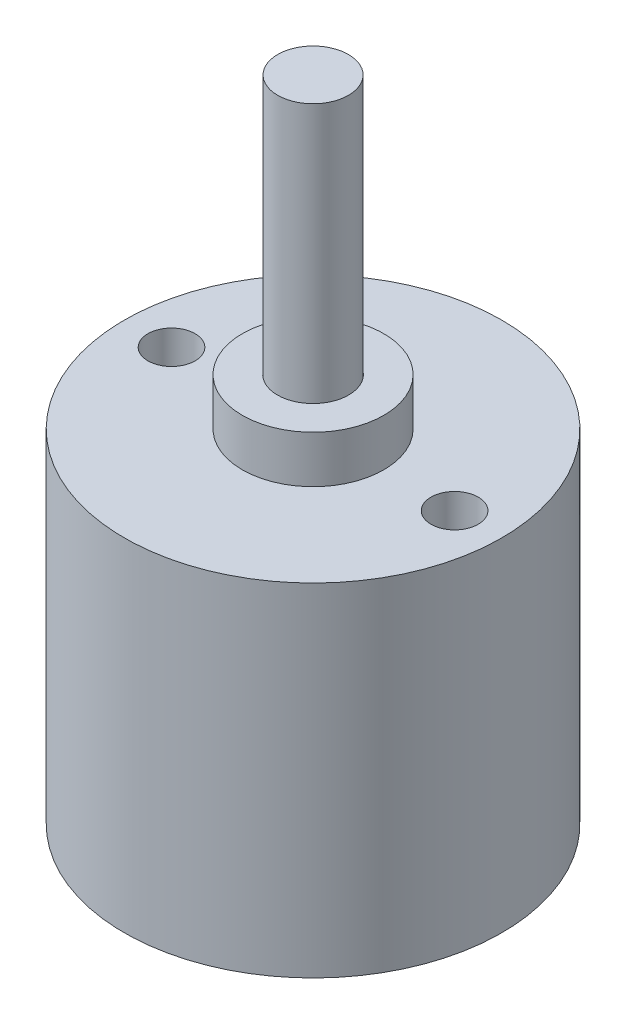
ISO-10303-21;
HEADER;
FILE_DESCRIPTION(('STEP AP214'),'2;1');
FILE_NAME('part.step','',(''),(''),'','','');
FILE_SCHEMA(('AUTOMOTIVE_DESIGN { 1 0 10303 214 1 1 1 1 }'));
ENDSEC;
DATA;
#1=APPLICATION_CONTEXT('core data for automotive mechanical design processes');
#2=APPLICATION_PROTOCOL_DEFINITION('international standard','automotive_design',2000,#1);
#3=PRODUCT_CONTEXT('',#1,'mechanical');
#4=PRODUCT('Part','Part','',(#3));
#5=PRODUCT_RELATED_PRODUCT_CATEGORY('part','',(#4));
#6=PRODUCT_DEFINITION_FORMATION('','',#4);
#7=PRODUCT_DEFINITION_CONTEXT('part definition',#1,'design');
#8=PRODUCT_DEFINITION('design','',#6,#7);
#9=PRODUCT_DEFINITION_SHAPE('','',#8);
#10=(LENGTH_UNIT() NAMED_UNIT(*) SI_UNIT(.MILLI.,.METRE.));
#11=(NAMED_UNIT(*) PLANE_ANGLE_UNIT() SI_UNIT($,.RADIAN.));
#12=(NAMED_UNIT(*) SI_UNIT($,.STERADIAN.) SOLID_ANGLE_UNIT());
#13=UNCERTAINTY_MEASURE_WITH_UNIT(LENGTH_MEASURE(1.E-05),#10,'distance_accuracy_value','');
#14=(GEOMETRIC_REPRESENTATION_CONTEXT(3) GLOBAL_UNCERTAINTY_ASSIGNED_CONTEXT((#13)) GLOBAL_UNIT_ASSIGNED_CONTEXT((#10,
#11,#12)) REPRESENTATION_CONTEXT('',''));
#15=CARTESIAN_POINT('',(0.,0.,0.));
#16=DIRECTION('',(0.,0.,1.));
#17=DIRECTION('',(1.,0.,0.));
#18=AXIS2_PLACEMENT_3D('',#15,#16,#17);
#19=CARTESIAN_POINT('',(0.,9.5,0.));
#20=DIRECTION('',(0.,1.,0.));
#21=DIRECTION('',(0.,0.,1.));
#22=AXIS2_PLACEMENT_3D('',#19,#20,#21);
#23=PLANE('',#22);
#24=CARTESIAN_POINT('',(0.,9.5,0.));
#25=DIRECTION('',(0.,1.,0.));
#26=DIRECTION('',(0.,0.,1.));
#27=AXIS2_PLACEMENT_3D('',#24,#25,#26);
#28=CIRCLE('',#27,1.51);
#29=CARTESIAN_POINT('',(0.,9.5,1.51));
#30=VERTEX_POINT('',#29);
#31=EDGE_CURVE('E52',#30,#30,#28,.T.);
#32=ORIENTED_EDGE('',*,*,#31,.T.);
#33=EDGE_LOOP('',(#32));
#34=FACE_BOUND('',#33,.T.);
#35=CARTESIAN_POINT('',(0.,9.5,0.));
#36=DIRECTION('',(0.,1.,0.));
#37=DIRECTION('',(0.,0.,1.));
#38=AXIS2_PLACEMENT_3D('',#35,#36,#37);
#39=CIRCLE('',#38,1.5);
#40=CARTESIAN_POINT('',(0.,9.5,1.5));
#41=VERTEX_POINT('',#40);
#42=EDGE_CURVE('E67',#41,#41,#39,.T.);
#43=ORIENTED_EDGE('',*,*,#42,.F.);
#44=EDGE_LOOP('',(#43));
#45=FACE_BOUND('',#44,.T.);
#46=ADVANCED_FACE('F30',(#34,#45),#23,.T.);
#47=CARTESIAN_POINT('',(0.,14.5,0.));
#48=DIRECTION('',(0.,1.,0.));
#49=DIRECTION('',(0.,0.,1.));
#50=AXIS2_PLACEMENT_3D('',#47,#48,#49);
#51=PLANE('',#50);
#52=CARTESIAN_POINT('',(0.,14.5,0.));
#53=DIRECTION('',(0.,1.,0.));
#54=DIRECTION('',(0.,0.,1.));
#55=AXIS2_PLACEMENT_3D('',#52,#53,#54);
#56=CIRCLE('',#55,8.);
#57=CARTESIAN_POINT('',(0.,14.5,-8.));
#58=VERTEX_POINT('',#57);
#59=EDGE_CURVE('E10',#58,#58,#56,.T.);
#60=ORIENTED_EDGE('',*,*,#59,.T.);
#61=EDGE_LOOP('',(#60));
#62=FACE_BOUND('',#61,.T.);
#63=CARTESIAN_POINT('',(6.,14.5,0.));
#64=DIRECTION('',(0.,1.,0.));
#65=DIRECTION('',(0.,0.,1.));
#66=AXIS2_PLACEMENT_3D('',#63,#64,#65);
#67=CIRCLE('',#66,1.);
#68=CARTESIAN_POINT('',(6.,14.5,1.));
#69=VERTEX_POINT('',#68);
#70=EDGE_CURVE('E43',#69,#69,#67,.T.);
#71=ORIENTED_EDGE('',*,*,#70,.F.);
#72=EDGE_LOOP('',(#71));
#73=FACE_BOUND('',#72,.T.);
#74=CARTESIAN_POINT('',(-6.,14.5,0.));
#75=DIRECTION('',(0.,1.,0.));
#76=DIRECTION('',(0.,0.,1.));
#77=AXIS2_PLACEMENT_3D('',#74,#75,#76);
#78=CIRCLE('',#77,1.);
#79=CARTESIAN_POINT('',(-6.,14.5,1.));
#80=VERTEX_POINT('',#79);
#81=EDGE_CURVE('E49',#80,#80,#78,.T.);
#82=ORIENTED_EDGE('',*,*,#81,.F.);
#83=EDGE_LOOP('',(#82));
#84=FACE_BOUND('',#83,.T.);
#85=CARTESIAN_POINT('',(0.,14.5,0.));
#86=DIRECTION('',(0.,1.,0.));
#87=DIRECTION('',(0.,0.,1.));
#88=AXIS2_PLACEMENT_3D('',#85,#86,#87);
#89=CIRCLE('',#88,3.);
#90=CARTESIAN_POINT('',(0.,14.5,3.));
#91=VERTEX_POINT('',#90);
#92=EDGE_CURVE('E58',#91,#91,#89,.T.);
#93=ORIENTED_EDGE('',*,*,#92,.F.);
#94=EDGE_LOOP('',(#93));
#95=FACE_BOUND('',#94,.T.);
#96=ADVANCED_FACE('F83',(#62,#73,#84,#95),#51,.T.);
#97=CARTESIAN_POINT('',(0.,14.5,0.));
#98=DIRECTION('',(0.,-1.,0.));
#99=DIRECTION('',(0.,0.,-1.));
#100=AXIS2_PLACEMENT_3D('',#97,#98,#99);
#101=CYLINDRICAL_SURFACE('',#100,8.);
#102=CARTESIAN_POINT('',(0.,0.,0.));
#103=DIRECTION('',(0.,1.,0.));
#104=DIRECTION('',(0.,0.,1.));
#105=AXIS2_PLACEMENT_3D('',#102,#103,#104);
#106=CIRCLE('',#105,8.);
#107=CARTESIAN_POINT('',(0.,0.,-8.));
#108=VERTEX_POINT('',#107);
#109=EDGE_CURVE('E34',#108,#108,#106,.T.);
#110=CARTESIAN_POINT('',(0.,14.5,-8.));
#111=CARTESIAN_POINT('',(0.,14.3489583333333,-8.));
#112=CARTESIAN_POINT('',(0.,14.1979166666667,-8.));
#113=CARTESIAN_POINT('',(0.,13.8958333333333,-8.));
#114=CARTESIAN_POINT('',(0.,13.7447916666667,-8.));
#115=CARTESIAN_POINT('',(0.,13.4427083333333,-8.));
#116=CARTESIAN_POINT('',(0.,13.2916666666667,-8.));
#117=CARTESIAN_POINT('',(0.,12.9895833333333,-8.));
#118=CARTESIAN_POINT('',(0.,12.8385416666667,-8.));
#119=CARTESIAN_POINT('',(0.,12.5364583333333,-8.));
#120=CARTESIAN_POINT('',(0.,12.3854166666667,-8.));
#121=CARTESIAN_POINT('',(0.,12.0833333333333,-8.));
#122=CARTESIAN_POINT('',(0.,11.9322916666667,-8.));
#123=CARTESIAN_POINT('',(0.,11.6302083333333,-8.));
#124=CARTESIAN_POINT('',(0.,11.4791666666667,-8.));
#125=CARTESIAN_POINT('',(0.,11.1770833333333,-8.));
#126=CARTESIAN_POINT('',(0.,11.0260416666667,-8.));
#127=CARTESIAN_POINT('',(0.,10.7239583333333,-8.));
#128=CARTESIAN_POINT('',(0.,10.5729166666667,-8.));
#129=CARTESIAN_POINT('',(0.,10.2708333333333,-8.));
#130=CARTESIAN_POINT('',(0.,10.1197916666667,-8.));
#131=CARTESIAN_POINT('',(0.,9.81770833333333,-8.));
#132=CARTESIAN_POINT('',(0.,9.66666666666667,-8.));
#133=CARTESIAN_POINT('',(0.,9.36458333333333,-8.));
#134=CARTESIAN_POINT('',(0.,9.21354166666667,-8.));
#135=CARTESIAN_POINT('',(0.,8.91145833333333,-8.));
#136=CARTESIAN_POINT('',(0.,8.76041666666667,-8.));
#137=CARTESIAN_POINT('',(0.,8.45833333333333,-8.));
#138=CARTESIAN_POINT('',(0.,8.30729166666667,-8.));
#139=CARTESIAN_POINT('',(0.,8.00520833333333,-8.));
#140=CARTESIAN_POINT('',(0.,7.85416666666667,-8.));
#141=CARTESIAN_POINT('',(0.,7.55208333333333,-8.));
#142=CARTESIAN_POINT('',(0.,7.40104166666667,-8.));
#143=CARTESIAN_POINT('',(0.,7.09895833333333,-8.));
#144=CARTESIAN_POINT('',(0.,6.94791666666667,-8.));
#145=CARTESIAN_POINT('',(0.,6.64583333333333,-8.));
#146=CARTESIAN_POINT('',(0.,6.49479166666667,-8.));
#147=CARTESIAN_POINT('',(0.,6.19270833333333,-8.));
#148=CARTESIAN_POINT('',(0.,6.04166666666667,-8.));
#149=CARTESIAN_POINT('',(0.,5.73958333333333,-8.));
#150=CARTESIAN_POINT('',(0.,5.58854166666667,-8.));
#151=CARTESIAN_POINT('',(0.,5.28645833333333,-8.));
#152=CARTESIAN_POINT('',(0.,5.13541666666667,-8.));
#153=CARTESIAN_POINT('',(0.,4.83333333333333,-8.));
#154=CARTESIAN_POINT('',(0.,4.68229166666667,-8.));
#155=CARTESIAN_POINT('',(0.,4.38020833333333,-8.));
#156=CARTESIAN_POINT('',(0.,4.22916666666667,-8.));
#157=CARTESIAN_POINT('',(0.,3.92708333333333,-8.));
#158=CARTESIAN_POINT('',(0.,3.77604166666667,-8.));
#159=CARTESIAN_POINT('',(0.,3.47395833333333,-8.));
#160=CARTESIAN_POINT('',(0.,3.32291666666667,-8.));
#161=CARTESIAN_POINT('',(0.,3.02083333333333,-8.));
#162=CARTESIAN_POINT('',(0.,2.86979166666667,-8.));
#163=CARTESIAN_POINT('',(0.,2.56770833333333,-8.));
#164=CARTESIAN_POINT('',(0.,2.41666666666667,-8.));
#165=CARTESIAN_POINT('',(0.,2.11458333333333,-8.));
#166=CARTESIAN_POINT('',(0.,1.96354166666667,-8.));
#167=CARTESIAN_POINT('',(0.,1.66145833333333,-8.));
#168=CARTESIAN_POINT('',(0.,1.51041666666667,-8.));
#169=CARTESIAN_POINT('',(0.,1.20833333333333,-8.));
#170=CARTESIAN_POINT('',(0.,1.05729166666667,-8.));
#171=CARTESIAN_POINT('',(0.,0.755208333333334,-8.));
#172=CARTESIAN_POINT('',(0.,0.604166666666667,-8.));
#173=CARTESIAN_POINT('',(0.,0.302083333333333,-8.));
#174=CARTESIAN_POINT('',(0.,0.151041666666667,-8.));
#175=CARTESIAN_POINT('',(0.,0.,-8.));
#176=B_SPLINE_CURVE_WITH_KNOTS('',3,(#110,#111,#112,#113,#114,#115,#116,#117,#118,#119,#120,
#121,#122,#123,#124,#125,#126,#127,#128,#129,#130,#131,#132,#133,#134,#135,#136,#137,#138,#139,
#140,#141,#142,#143,#144,#145,#146,#147,#148,#149,#150,#151,#152,#153,#154,#155,#156,#157,#158,
#159,#160,#161,#162,#163,#164,#165,#166,#167,#168,#169,#170,#171,#172,#173,#174,#175),
.UNSPECIFIED.,.F.,.F.,(4,2,2,2,2,2,2,2,2,2,2,2,2,2,2,2,2,2,2,2,2,2,2,2,2,2,2,2,2,2,2,2,4),(0.,
0.453124999999999,0.906249999999999,1.359375,1.8125,2.265625,2.71875,3.171875,3.625,4.078125,
4.53125,4.984375,5.4375,5.890625,6.34375,6.796875,7.25,7.703125,8.15625,8.609375,9.0625,
9.515625,9.96875,10.421875,10.875,11.328125,11.78125,12.234375,12.6875,13.140625,13.59375,
14.046875,14.5),.UNSPECIFIED.);
#177=EDGE_CURVE('BSEAM32',#58,#108,#176,.T.);
#178=ORIENTED_EDGE('',*,*,#59,.F.);
#179=ORIENTED_EDGE('',*,*,#109,.T.);
#180=ORIENTED_EDGE('',*,*,#177,.T.);
#181=ORIENTED_EDGE('',*,*,#177,.F.);
#182=EDGE_LOOP('',(#178,#180,#179,#181));
#183=FACE_BOUND('',#182,.T.);
#184=ADVANCED_FACE('F32',(#183),#101,.T.);
#185=CARTESIAN_POINT('',(0.,0.,0.));
#186=DIRECTION('',(0.,1.,0.));
#187=DIRECTION('',(0.,0.,1.));
#188=AXIS2_PLACEMENT_3D('',#185,#186,#187);
#189=PLANE('',#188);
#190=ORIENTED_EDGE('',*,*,#109,.F.);
#191=EDGE_LOOP('',(#190));
#192=FACE_BOUND('',#191,.T.);
#193=ADVANCED_FACE('F112',(#192),#189,.F.);
#194=CARTESIAN_POINT('',(6.,9.5,0.));
#195=DIRECTION('',(0.,1.,0.));
#196=DIRECTION('',(0.,0.,1.));
#197=AXIS2_PLACEMENT_3D('',#194,#195,#196);
#198=CYLINDRICAL_SURFACE('',#197,1.);
#199=CARTESIAN_POINT('',(6.,9.5,0.));
#200=DIRECTION('',(0.,1.,0.));
#201=DIRECTION('',(0.,0.,1.));
#202=AXIS2_PLACEMENT_3D('',#199,#200,#201);
#203=CIRCLE('',#202,1.);
#204=CARTESIAN_POINT('',(6.,9.5,1.));
#205=VERTEX_POINT('',#204);
#206=EDGE_CURVE('E41',#205,#205,#203,.T.);
#207=ORIENTED_EDGE('',*,*,#206,.F.);
#208=EDGE_LOOP('',(#207));
#209=FACE_BOUND('',#208,.T.);
#210=ORIENTED_EDGE('',*,*,#70,.T.);
#211=EDGE_LOOP('',(#210));
#212=FACE_BOUND('',#211,.T.);
#213=ADVANCED_FACE('F109',(#209,#212),#198,.F.);
#214=CARTESIAN_POINT('',(6.,9.5,0.));
#215=DIRECTION('',(0.,1.,0.));
#216=DIRECTION('',(0.,0.,1.));
#217=AXIS2_PLACEMENT_3D('',#214,#215,#216);
#218=PLANE('',#217);
#219=ORIENTED_EDGE('',*,*,#206,.T.);
#220=EDGE_LOOP('',(#219));
#221=FACE_BOUND('',#220,.T.);
#222=ADVANCED_FACE('F105',(#221),#218,.T.);
#223=CARTESIAN_POINT('',(-6.,9.5,0.));
#224=DIRECTION('',(0.,1.,0.));
#225=DIRECTION('',(0.,0.,1.));
#226=AXIS2_PLACEMENT_3D('',#223,#224,#225);
#227=CYLINDRICAL_SURFACE('',#226,1.);
#228=CARTESIAN_POINT('',(-6.,9.5,0.));
#229=DIRECTION('',(0.,1.,0.));
#230=DIRECTION('',(0.,0.,1.));
#231=AXIS2_PLACEMENT_3D('',#228,#229,#230);
#232=CIRCLE('',#231,1.);
#233=CARTESIAN_POINT('',(-6.,9.5,1.));
#234=VERTEX_POINT('',#233);
#235=EDGE_CURVE('E46',#234,#234,#232,.T.);
#236=ORIENTED_EDGE('',*,*,#235,.F.);
#237=EDGE_LOOP('',(#236));
#238=FACE_BOUND('',#237,.T.);
#239=ORIENTED_EDGE('',*,*,#81,.T.);
#240=EDGE_LOOP('',(#239));
#241=FACE_BOUND('',#240,.T.);
#242=ADVANCED_FACE('F101',(#238,#241),#227,.F.);
#243=CARTESIAN_POINT('',(-6.,9.5,0.));
#244=DIRECTION('',(0.,1.,0.));
#245=DIRECTION('',(0.,0.,1.));
#246=AXIS2_PLACEMENT_3D('',#243,#244,#245);
#247=PLANE('',#246);
#248=ORIENTED_EDGE('',*,*,#235,.T.);
#249=EDGE_LOOP('',(#248));
#250=FACE_BOUND('',#249,.T.);
#251=ADVANCED_FACE('F97',(#250),#247,.T.);
#252=CARTESIAN_POINT('',(0.,16.5,0.));
#253=DIRECTION('',(0.,1.,0.));
#254=DIRECTION('',(0.,0.,1.));
#255=AXIS2_PLACEMENT_3D('',#252,#253,#254);
#256=PLANE('',#255);
#257=CARTESIAN_POINT('',(0.,16.5,0.));
#258=DIRECTION('',(0.,1.,0.));
#259=DIRECTION('',(0.,0.,1.));
#260=AXIS2_PLACEMENT_3D('',#257,#258,#259);
#261=CIRCLE('',#260,3.);
#262=CARTESIAN_POINT('',(0.,16.5,3.));
#263=VERTEX_POINT('',#262);
#264=EDGE_CURVE('E57',#263,#263,#261,.T.);
#265=ORIENTED_EDGE('',*,*,#264,.T.);
#266=EDGE_LOOP('',(#265));
#267=FACE_BOUND('',#266,.T.);
#268=CARTESIAN_POINT('',(0.,16.5,0.));
#269=DIRECTION('',(0.,1.,0.));
#270=DIRECTION('',(0.,0.,1.));
#271=AXIS2_PLACEMENT_3D('',#268,#269,#270);
#272=CIRCLE('',#271,1.51);
#273=CARTESIAN_POINT('',(0.,16.5,1.51));
#274=VERTEX_POINT('',#273);
#275=EDGE_CURVE('E61',#274,#274,#272,.T.);
#276=ORIENTED_EDGE('',*,*,#275,.F.);
#277=EDGE_LOOP('',(#276));
#278=FACE_BOUND('',#277,.T.);
#279=ADVANCED_FACE('F100',(#267,#278),#256,.T.);
#280=CARTESIAN_POINT('',(0.,16.5,0.));
#281=DIRECTION('',(0.,-1.,0.));
#282=DIRECTION('',(0.,0.,-1.));
#283=AXIS2_PLACEMENT_3D('',#280,#281,#282);
#284=CYLINDRICAL_SURFACE('',#283,3.);
#285=ORIENTED_EDGE('',*,*,#264,.F.);
#286=EDGE_LOOP('',(#285));
#287=FACE_BOUND('',#286,.T.);
#288=ORIENTED_EDGE('',*,*,#92,.T.);
#289=EDGE_LOOP('',(#288));
#290=FACE_BOUND('',#289,.T.);
#291=ADVANCED_FACE('F92',(#287,#290),#284,.T.);
#292=CARTESIAN_POINT('',(0.,9.5,0.));
#293=DIRECTION('',(0.,1.,0.));
#294=DIRECTION('',(0.,0.,1.));
#295=AXIS2_PLACEMENT_3D('',#292,#293,#294);
#296=CYLINDRICAL_SURFACE('',#295,1.51);
#297=ORIENTED_EDGE('',*,*,#31,.F.);
#298=EDGE_LOOP('',(#297));
#299=FACE_BOUND('',#298,.T.);
#300=ORIENTED_EDGE('',*,*,#275,.T.);
#301=EDGE_LOOP('',(#300));
#302=FACE_BOUND('',#301,.T.);
#303=ADVANCED_FACE('F78',(#299,#302),#296,.F.);
#304=CARTESIAN_POINT('',(0.,27.5,0.));
#305=DIRECTION('',(0.,-1.,0.));
#306=DIRECTION('',(0.,0.,-1.));
#307=AXIS2_PLACEMENT_3D('',#304,#305,#306);
#308=CYLINDRICAL_SURFACE('',#307,1.5);
#309=CARTESIAN_POINT('',(0.,27.5,0.));
#310=DIRECTION('',(0.,1.,0.));
#311=DIRECTION('',(0.,0.,1.));
#312=AXIS2_PLACEMENT_3D('',#309,#310,#311);
#313=CIRCLE('',#312,1.5);
#314=CARTESIAN_POINT('',(0.,27.5,1.5));
#315=VERTEX_POINT('',#314);
#316=EDGE_CURVE('E66',#315,#315,#313,.T.);
#317=ORIENTED_EDGE('',*,*,#316,.F.);
#318=EDGE_LOOP('',(#317));
#319=FACE_BOUND('',#318,.T.);
#320=ORIENTED_EDGE('',*,*,#42,.T.);
#321=EDGE_LOOP('',(#320));
#322=FACE_BOUND('',#321,.T.);
#323=ADVANCED_FACE('F75',(#319,#322),#308,.T.);
#324=CARTESIAN_POINT('',(0.,27.5,0.));
#325=DIRECTION('',(0.,1.,0.));
#326=DIRECTION('',(0.,0.,1.));
#327=AXIS2_PLACEMENT_3D('',#324,#325,#326);
#328=PLANE('',#327);
#329=ORIENTED_EDGE('',*,*,#316,.T.);
#330=EDGE_LOOP('',(#329));
#331=FACE_BOUND('',#330,.T.);
#332=ADVANCED_FACE('F73',(#331),#328,.T.);
#333=CLOSED_SHELL('',(#46,#96,#184,#193,#213,#222,#242,#251,#279,#291,#303,#323,#332));
#334=MANIFOLD_SOLID_BREP('B2',#333);
#335=ADVANCED_BREP_SHAPE_REPRESENTATION('',(#18,#334),#14);
#336=SHAPE_DEFINITION_REPRESENTATION(#9,#335);
ENDSEC;
END-ISO-10303-21;
